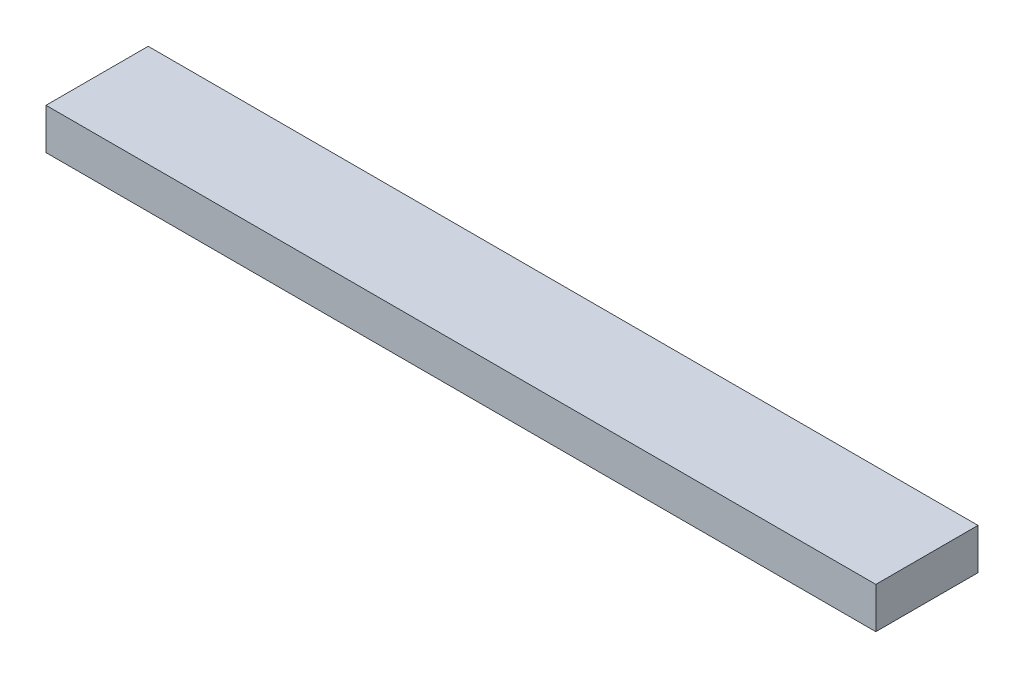
ISO-10303-21;
HEADER;
FILE_DESCRIPTION(('STEP AP214'),'2;1');
FILE_NAME('part.step','',(''),(''),'','','');
FILE_SCHEMA(('AUTOMOTIVE_DESIGN { 1 0 10303 214 1 1 1 1 }'));
ENDSEC;
DATA;
#1=APPLICATION_CONTEXT('core data for automotive mechanical design processes');
#2=APPLICATION_PROTOCOL_DEFINITION('international standard','automotive_design',2000,#1);
#3=PRODUCT_CONTEXT('',#1,'mechanical');
#4=PRODUCT('Part','Part','',(#3));
#5=PRODUCT_RELATED_PRODUCT_CATEGORY('part','',(#4));
#6=PRODUCT_DEFINITION_FORMATION('','',#4);
#7=PRODUCT_DEFINITION_CONTEXT('part definition',#1,'design');
#8=PRODUCT_DEFINITION('design','',#6,#7);
#9=PRODUCT_DEFINITION_SHAPE('','',#8);
#10=(LENGTH_UNIT() NAMED_UNIT(*) SI_UNIT(.MILLI.,.METRE.));
#11=(NAMED_UNIT(*) PLANE_ANGLE_UNIT() SI_UNIT($,.RADIAN.));
#12=(NAMED_UNIT(*) SI_UNIT($,.STERADIAN.) SOLID_ANGLE_UNIT());
#13=UNCERTAINTY_MEASURE_WITH_UNIT(LENGTH_MEASURE(1.E-05),#10,'distance_accuracy_value','');
#14=(GEOMETRIC_REPRESENTATION_CONTEXT(3) GLOBAL_UNCERTAINTY_ASSIGNED_CONTEXT((#13)) GLOBAL_UNIT_ASSIGNED_CONTEXT((#10,
#11,#12)) REPRESENTATION_CONTEXT('',''));
#15=CARTESIAN_POINT('',(0.,0.,0.));
#16=DIRECTION('',(0.,0.,1.));
#17=DIRECTION('',(1.,0.,0.));
#18=AXIS2_PLACEMENT_3D('',#15,#16,#17);
#19=CARTESIAN_POINT('',(31.875,-3.15,-3.925));
#20=DIRECTION('',(1.,0.,0.));
#21=DIRECTION('',(0.,0.,-1.));
#22=AXIS2_PLACEMENT_3D('',#19,#20,#21);
#23=PLANE('',#22);
#24=DIRECTION('',(0.,0.,-1.));
#25=VECTOR('',#24,1.);
#26=CARTESIAN_POINT('',(31.875,0.,-3.925));
#27=LINE('',#26,#25);
#28=CARTESIAN_POINT('',(31.875,0.,3.925));
#29=VERTEX_POINT('',#28);
#30=CARTESIAN_POINT('',(31.875,0.,-3.925));
#31=VERTEX_POINT('',#30);
#32=EDGE_CURVE('E118',#29,#31,#27,.T.);
#33=ORIENTED_EDGE('',*,*,#32,.F.);
#34=DIRECTION('',(0.,1.,0.));
#35=VECTOR('',#34,1.);
#36=CARTESIAN_POINT('',(31.875,-3.15,3.925));
#37=LINE('',#36,#35);
#38=CARTESIAN_POINT('',(31.875,-3.15,3.925));
#39=VERTEX_POINT('',#38);
#40=EDGE_CURVE('E58',#39,#29,#37,.T.);
#41=ORIENTED_EDGE('',*,*,#40,.F.);
#42=DIRECTION('',(0.,0.,-1.));
#43=VECTOR('',#42,1.);
#44=CARTESIAN_POINT('',(31.875,-3.15,-3.925));
#45=LINE('',#44,#43);
#46=CARTESIAN_POINT('',(31.875,-3.15,-3.925));
#47=VERTEX_POINT('',#46);
#48=EDGE_CURVE('E150',#39,#47,#45,.T.);
#49=ORIENTED_EDGE('',*,*,#48,.T.);
#50=DIRECTION('',(0.,1.,0.));
#51=VECTOR('',#50,1.);
#52=CARTESIAN_POINT('',(31.875,-3.15,-3.925));
#53=LINE('',#52,#51);
#54=EDGE_CURVE('E84',#47,#31,#53,.T.);
#55=ORIENTED_EDGE('',*,*,#54,.T.);
#56=EDGE_LOOP('',(#33,#41,#49,#55));
#57=FACE_BOUND('',#56,.T.);
#58=ADVANCED_FACE('F35',(#57),#23,.T.);
#59=CARTESIAN_POINT('',(-31.875,-3.15,3.925));
#60=DIRECTION('',(0.,0.,1.));
#61=DIRECTION('',(1.,0.,0.));
#62=AXIS2_PLACEMENT_3D('',#59,#60,#61);
#63=PLANE('',#62);
#64=DIRECTION('',(1.,0.,0.));
#65=VECTOR('',#64,1.);
#66=CARTESIAN_POINT('',(-31.875,0.,3.925));
#67=LINE('',#66,#65);
#68=CARTESIAN_POINT('',(-31.875,0.,3.925));
#69=VERTEX_POINT('',#68);
#70=EDGE_CURVE('E153',#69,#29,#67,.T.);
#71=ORIENTED_EDGE('',*,*,#70,.F.);
#72=DIRECTION('',(0.,1.,0.));
#73=VECTOR('',#72,1.);
#74=CARTESIAN_POINT('',(-31.875,-3.15,3.925));
#75=LINE('',#74,#73);
#76=CARTESIAN_POINT('',(-31.875,-3.15,3.925));
#77=VERTEX_POINT('',#76);
#78=EDGE_CURVE('E172',#77,#69,#75,.T.);
#79=ORIENTED_EDGE('',*,*,#78,.F.);
#80=DIRECTION('',(1.,0.,0.));
#81=VECTOR('',#80,1.);
#82=CARTESIAN_POINT('',(-31.875,-3.15,3.925));
#83=LINE('',#82,#81);
#84=EDGE_CURVE('E158',#77,#39,#83,.T.);
#85=ORIENTED_EDGE('',*,*,#84,.T.);
#86=ORIENTED_EDGE('',*,*,#40,.T.);
#87=EDGE_LOOP('',(#71,#79,#85,#86));
#88=FACE_BOUND('',#87,.T.);
#89=ADVANCED_FACE('F226',(#88),#63,.T.);
#90=CARTESIAN_POINT('',(-31.875,-3.15,-3.925));
#91=DIRECTION('',(-1.,0.,0.));
#92=DIRECTION('',(0.,0.,1.));
#93=AXIS2_PLACEMENT_3D('',#90,#91,#92);
#94=PLANE('',#93);
#95=DIRECTION('',(0.,0.,1.));
#96=VECTOR('',#95,1.);
#97=CARTESIAN_POINT('',(-31.875,0.,-3.925));
#98=LINE('',#97,#96);
#99=CARTESIAN_POINT('',(-31.875,0.,-3.925));
#100=VERTEX_POINT('',#99);
#101=EDGE_CURVE('E165',#100,#69,#98,.T.);
#102=ORIENTED_EDGE('',*,*,#101,.F.);
#103=DIRECTION('',(0.,1.,0.));
#104=VECTOR('',#103,1.);
#105=CARTESIAN_POINT('',(-31.875,-3.15,-3.925));
#106=LINE('',#105,#104);
#107=CARTESIAN_POINT('',(-31.875,-3.15,-3.925));
#108=VERTEX_POINT('',#107);
#109=EDGE_CURVE('E174',#108,#100,#106,.T.);
#110=ORIENTED_EDGE('',*,*,#109,.F.);
#111=DIRECTION('',(0.,0.,1.));
#112=VECTOR('',#111,1.);
#113=CARTESIAN_POINT('',(-31.875,-3.15,-3.925));
#114=LINE('',#113,#112);
#115=EDGE_CURVE('E155',#108,#77,#114,.T.);
#116=ORIENTED_EDGE('',*,*,#115,.T.);
#117=ORIENTED_EDGE('',*,*,#78,.T.);
#118=EDGE_LOOP('',(#102,#110,#116,#117));
#119=FACE_BOUND('',#118,.T.);
#120=ADVANCED_FACE('F230',(#119),#94,.T.);
#121=CARTESIAN_POINT('',(-31.875,-3.15,-3.925));
#122=DIRECTION('',(0.,0.,-1.));
#123=DIRECTION('',(-1.,0.,0.));
#124=AXIS2_PLACEMENT_3D('',#121,#122,#123);
#125=PLANE('',#124);
#126=DIRECTION('',(-1.,0.,0.));
#127=VECTOR('',#126,1.);
#128=CARTESIAN_POINT('',(-31.875,0.,-3.925));
#129=LINE('',#128,#127);
#130=EDGE_CURVE('E162',#31,#100,#129,.T.);
#131=ORIENTED_EDGE('',*,*,#130,.F.);
#132=ORIENTED_EDGE('',*,*,#54,.F.);
#133=DIRECTION('',(-1.,0.,0.));
#134=VECTOR('',#133,1.);
#135=CARTESIAN_POINT('',(-31.875,-3.15,-3.925));
#136=LINE('',#135,#134);
#137=EDGE_CURVE('E152',#47,#108,#136,.T.);
#138=ORIENTED_EDGE('',*,*,#137,.T.);
#139=ORIENTED_EDGE('',*,*,#109,.T.);
#140=EDGE_LOOP('',(#131,#132,#138,#139));
#141=FACE_BOUND('',#140,.T.);
#142=ADVANCED_FACE('F240',(#141),#125,.T.);
#143=CARTESIAN_POINT('',(0.,-3.15,0.));
#144=DIRECTION('',(0.,1.,0.));
#145=DIRECTION('',(0.,0.,1.));
#146=AXIS2_PLACEMENT_3D('',#143,#144,#145);
#147=PLANE('',#146);
#148=DIRECTION('',(1.,0.,0.));
#149=VECTOR('',#148,1.);
#150=CARTESIAN_POINT('',(0.,-3.15,2.425));
#151=LINE('',#150,#149);
#152=CARTESIAN_POINT('',(-30.375,-3.15,2.425));
#153=VERTEX_POINT('',#152);
#154=CARTESIAN_POINT('',(30.375,-3.15,2.425));
#155=VERTEX_POINT('',#154);
#156=EDGE_CURVE('E145',#153,#155,#151,.T.);
#157=ORIENTED_EDGE('',*,*,#156,.T.);
#158=DIRECTION('',(0.,0.,-1.));
#159=VECTOR('',#158,1.);
#160=CARTESIAN_POINT('',(30.375,-3.15,0.));
#161=LINE('',#160,#159);
#162=CARTESIAN_POINT('',(30.375,-3.15,-2.425));
#163=VERTEX_POINT('',#162);
#164=EDGE_CURVE('E113',#155,#163,#161,.T.);
#165=ORIENTED_EDGE('',*,*,#164,.T.);
#166=DIRECTION('',(-1.,0.,0.));
#167=VECTOR('',#166,1.);
#168=CARTESIAN_POINT('',(0.,-3.15,-2.425));
#169=LINE('',#168,#167);
#170=CARTESIAN_POINT('',(-30.375,-3.15,-2.425));
#171=VERTEX_POINT('',#170);
#172=EDGE_CURVE('E135',#163,#171,#169,.T.);
#173=ORIENTED_EDGE('',*,*,#172,.T.);
#174=DIRECTION('',(0.,0.,1.));
#175=VECTOR('',#174,1.);
#176=CARTESIAN_POINT('',(-30.375,-3.15,0.));
#177=LINE('',#176,#175);
#178=EDGE_CURVE('E49',#171,#153,#177,.T.);
#179=ORIENTED_EDGE('',*,*,#178,.T.);
#180=EDGE_LOOP('',(#157,#165,#173,#179));
#181=FACE_BOUND('',#180,.T.);
#182=ORIENTED_EDGE('',*,*,#48,.F.);
#183=ORIENTED_EDGE('',*,*,#84,.F.);
#184=ORIENTED_EDGE('',*,*,#115,.F.);
#185=ORIENTED_EDGE('',*,*,#137,.F.);
#186=EDGE_LOOP('',(#182,#183,#184,#185));
#187=FACE_BOUND('',#186,.T.);
#188=ADVANCED_FACE('F239',(#181,#187),#147,.F.);
#189=CARTESIAN_POINT('',(0.,0.,0.));
#190=DIRECTION('',(0.,1.,0.));
#191=DIRECTION('',(0.,0.,1.));
#192=AXIS2_PLACEMENT_3D('',#189,#190,#191);
#193=PLANE('',#192);
#194=ORIENTED_EDGE('',*,*,#32,.T.);
#195=ORIENTED_EDGE('',*,*,#130,.T.);
#196=ORIENTED_EDGE('',*,*,#101,.T.);
#197=ORIENTED_EDGE('',*,*,#70,.T.);
#198=EDGE_LOOP('',(#194,#195,#196,#197));
#199=FACE_BOUND('',#198,.T.);
#200=ADVANCED_FACE('F233',(#199),#193,.T.);
#201=CARTESIAN_POINT('',(30.375,-3.15,-3.925));
#202=DIRECTION('',(1.,0.,0.));
#203=DIRECTION('',(0.,0.,-1.));
#204=AXIS2_PLACEMENT_3D('',#201,#202,#203);
#205=PLANE('',#204);
#206=DIRECTION('',(0.,0.,-1.));
#207=VECTOR('',#206,1.);
#208=CARTESIAN_POINT('',(30.375,-1.5,0.));
#209=LINE('',#208,#207);
#210=CARTESIAN_POINT('',(30.375,-1.5,2.425));
#211=VERTEX_POINT('',#210);
#212=CARTESIAN_POINT('',(30.375,-1.5,-2.425));
#213=VERTEX_POINT('',#212);
#214=EDGE_CURVE('E111',#211,#213,#209,.T.);
#215=ORIENTED_EDGE('',*,*,#214,.T.);
#216=DIRECTION('',(0.,1.,0.));
#217=VECTOR('',#216,1.);
#218=CARTESIAN_POINT('',(30.375,-3.15,-2.425));
#219=LINE('',#218,#217);
#220=EDGE_CURVE('E140',#163,#213,#219,.T.);
#221=ORIENTED_EDGE('',*,*,#220,.F.);
#222=ORIENTED_EDGE('',*,*,#164,.F.);
#223=DIRECTION('',(0.,1.,0.));
#224=VECTOR('',#223,1.);
#225=CARTESIAN_POINT('',(30.375,-3.15,2.425));
#226=LINE('',#225,#224);
#227=EDGE_CURVE('E108',#155,#211,#226,.T.);
#228=ORIENTED_EDGE('',*,*,#227,.T.);
#229=EDGE_LOOP('',(#215,#221,#222,#228));
#230=FACE_BOUND('',#229,.T.);
#231=ADVANCED_FACE('F110',(#230),#205,.F.);
#232=CARTESIAN_POINT('',(-31.875,-3.15,2.425));
#233=DIRECTION('',(0.,0.,1.));
#234=DIRECTION('',(1.,0.,0.));
#235=AXIS2_PLACEMENT_3D('',#232,#233,#234);
#236=PLANE('',#235);
#237=DIRECTION('',(1.,0.,0.));
#238=VECTOR('',#237,1.);
#239=CARTESIAN_POINT('',(0.,-1.5,2.425));
#240=LINE('',#239,#238);
#241=CARTESIAN_POINT('',(-30.375,-1.5,2.425));
#242=VERTEX_POINT('',#241);
#243=EDGE_CURVE('E126',#242,#211,#240,.T.);
#244=ORIENTED_EDGE('',*,*,#243,.T.);
#245=ORIENTED_EDGE('',*,*,#227,.F.);
#246=ORIENTED_EDGE('',*,*,#156,.F.);
#247=DIRECTION('',(0.,1.,0.));
#248=VECTOR('',#247,1.);
#249=CARTESIAN_POINT('',(-30.375,-3.15,2.425));
#250=LINE('',#249,#248);
#251=EDGE_CURVE('E119',#153,#242,#250,.T.);
#252=ORIENTED_EDGE('',*,*,#251,.T.);
#253=EDGE_LOOP('',(#244,#245,#246,#252));
#254=FACE_BOUND('',#253,.T.);
#255=ADVANCED_FACE('F131',(#254),#236,.F.);
#256=CARTESIAN_POINT('',(-30.375,-3.15,-3.925));
#257=DIRECTION('',(-1.,0.,0.));
#258=DIRECTION('',(0.,0.,1.));
#259=AXIS2_PLACEMENT_3D('',#256,#257,#258);
#260=PLANE('',#259);
#261=DIRECTION('',(0.,0.,1.));
#262=VECTOR('',#261,1.);
#263=CARTESIAN_POINT('',(-30.375,-1.5,0.));
#264=LINE('',#263,#262);
#265=CARTESIAN_POINT('',(-30.375,-1.5,-2.425));
#266=VERTEX_POINT('',#265);
#267=EDGE_CURVE('E133',#266,#242,#264,.T.);
#268=ORIENTED_EDGE('',*,*,#267,.T.);
#269=ORIENTED_EDGE('',*,*,#251,.F.);
#270=ORIENTED_EDGE('',*,*,#178,.F.);
#271=DIRECTION('',(0.,1.,0.));
#272=VECTOR('',#271,1.);
#273=CARTESIAN_POINT('',(-30.375,-3.15,-2.425));
#274=LINE('',#273,#272);
#275=EDGE_CURVE('E141',#171,#266,#274,.T.);
#276=ORIENTED_EDGE('',*,*,#275,.T.);
#277=EDGE_LOOP('',(#268,#269,#270,#276));
#278=FACE_BOUND('',#277,.T.);
#279=ADVANCED_FACE('F254',(#278),#260,.F.);
#280=CARTESIAN_POINT('',(-31.875,-3.15,-2.425));
#281=DIRECTION('',(0.,0.,-1.));
#282=DIRECTION('',(-1.,0.,0.));
#283=AXIS2_PLACEMENT_3D('',#280,#281,#282);
#284=PLANE('',#283);
#285=DIRECTION('',(-1.,0.,0.));
#286=VECTOR('',#285,1.);
#287=CARTESIAN_POINT('',(0.,-1.5,-2.425));
#288=LINE('',#287,#286);
#289=EDGE_CURVE('E128',#213,#266,#288,.T.);
#290=ORIENTED_EDGE('',*,*,#289,.T.);
#291=ORIENTED_EDGE('',*,*,#275,.F.);
#292=ORIENTED_EDGE('',*,*,#172,.F.);
#293=ORIENTED_EDGE('',*,*,#220,.T.);
#294=EDGE_LOOP('',(#290,#291,#292,#293));
#295=FACE_BOUND('',#294,.T.);
#296=ADVANCED_FACE('F198',(#295),#284,.F.);
#297=CARTESIAN_POINT('',(0.,-1.5,0.));
#298=DIRECTION('',(0.,1.,0.));
#299=DIRECTION('',(0.,0.,1.));
#300=AXIS2_PLACEMENT_3D('',#297,#298,#299);
#301=PLANE('',#300);
#302=CARTESIAN_POINT('',(23.91375,-1.5,0.));
#303=DIRECTION('',(0.,1.,0.));
#304=DIRECTION('',(0.,0.,1.));
#305=AXIS2_PLACEMENT_3D('',#302,#303,#304);
#306=CIRCLE('',#305,1.5);
#307=CARTESIAN_POINT('',(23.91375,-1.5,1.5));
#308=VERTEX_POINT('',#307);
#309=EDGE_CURVE('E12',#308,#308,#306,.F.);
#310=ORIENTED_EDGE('',*,*,#309,.F.);
#311=EDGE_LOOP('',(#310));
#312=FACE_BOUND('',#311,.T.);
#313=CARTESIAN_POINT('',(15.94375,-1.5,0.));
#314=DIRECTION('',(0.,1.,0.));
#315=DIRECTION('',(0.,0.,1.));
#316=AXIS2_PLACEMENT_3D('',#313,#314,#315);
#317=CIRCLE('',#316,1.5);
#318=CARTESIAN_POINT('',(15.94375,-1.5,1.5));
#319=VERTEX_POINT('',#318);
#320=EDGE_CURVE('E42',#319,#319,#317,.F.);
#321=ORIENTED_EDGE('',*,*,#320,.F.);
#322=EDGE_LOOP('',(#321));
#323=FACE_BOUND('',#322,.T.);
#324=CARTESIAN_POINT('',(7.97375000000001,-1.5,0.));
#325=DIRECTION('',(0.,1.,0.));
#326=DIRECTION('',(0.,0.,1.));
#327=AXIS2_PLACEMENT_3D('',#324,#325,#326);
#328=CIRCLE('',#327,1.5);
#329=CARTESIAN_POINT('',(7.97375000000001,-1.5,1.5));
#330=VERTEX_POINT('',#329);
#331=EDGE_CURVE('E188',#330,#330,#328,.F.);
#332=ORIENTED_EDGE('',*,*,#331,.F.);
#333=EDGE_LOOP('',(#332));
#334=FACE_BOUND('',#333,.T.);
#335=CARTESIAN_POINT('',(0.00375000000000722,-1.5,0.));
#336=DIRECTION('',(0.,1.,0.));
#337=DIRECTION('',(0.,0.,1.));
#338=AXIS2_PLACEMENT_3D('',#335,#336,#337);
#339=CIRCLE('',#338,1.5);
#340=CARTESIAN_POINT('',(0.00375000000000722,-1.5,1.5));
#341=VERTEX_POINT('',#340);
#342=EDGE_CURVE('E185',#341,#341,#339,.F.);
#343=ORIENTED_EDGE('',*,*,#342,.F.);
#344=EDGE_LOOP('',(#343));
#345=FACE_BOUND('',#344,.T.);
#346=CARTESIAN_POINT('',(-7.96624999999999,-1.5,0.));
#347=DIRECTION('',(0.,1.,0.));
#348=DIRECTION('',(0.,0.,1.));
#349=AXIS2_PLACEMENT_3D('',#346,#347,#348);
#350=CIRCLE('',#349,1.5);
#351=CARTESIAN_POINT('',(-7.96624999999999,-1.5,1.5));
#352=VERTEX_POINT('',#351);
#353=EDGE_CURVE('E182',#352,#352,#350,.F.);
#354=ORIENTED_EDGE('',*,*,#353,.F.);
#355=EDGE_LOOP('',(#354));
#356=FACE_BOUND('',#355,.T.);
#357=CARTESIAN_POINT('',(-15.93625,-1.5,0.));
#358=DIRECTION('',(0.,1.,0.));
#359=DIRECTION('',(0.,0.,1.));
#360=AXIS2_PLACEMENT_3D('',#357,#358,#359);
#361=CIRCLE('',#360,1.5);
#362=CARTESIAN_POINT('',(-15.93625,-1.5,1.5));
#363=VERTEX_POINT('',#362);
#364=EDGE_CURVE('E179',#363,#363,#361,.F.);
#365=ORIENTED_EDGE('',*,*,#364,.F.);
#366=EDGE_LOOP('',(#365));
#367=FACE_BOUND('',#366,.T.);
#368=CARTESIAN_POINT('',(-23.90625,-1.5,0.));
#369=DIRECTION('',(0.,1.,0.));
#370=DIRECTION('',(0.,0.,1.));
#371=AXIS2_PLACEMENT_3D('',#368,#369,#370);
#372=CIRCLE('',#371,1.5);
#373=CARTESIAN_POINT('',(-23.90625,-1.5,1.5));
#374=VERTEX_POINT('',#373);
#375=EDGE_CURVE('E171',#374,#374,#372,.F.);
#376=ORIENTED_EDGE('',*,*,#375,.F.);
#377=EDGE_LOOP('',(#376));
#378=FACE_BOUND('',#377,.T.);
#379=ORIENTED_EDGE('',*,*,#214,.F.);
#380=ORIENTED_EDGE('',*,*,#243,.F.);
#381=ORIENTED_EDGE('',*,*,#267,.F.);
#382=ORIENTED_EDGE('',*,*,#289,.F.);
#383=EDGE_LOOP('',(#379,#380,#381,#382));
#384=FACE_BOUND('',#383,.T.);
#385=ADVANCED_FACE('F124',(#312,#323,#334,#345,#356,#367,#378,#384),#301,.F.);
#386=CARTESIAN_POINT('',(-23.90625,-7.39264068711929,0.));
#387=DIRECTION('',(0.,1.,0.));
#388=DIRECTION('',(0.,0.,1.));
#389=AXIS2_PLACEMENT_3D('',#386,#387,#388);
#390=CYLINDRICAL_SURFACE('',#389,1.5);
#391=CARTESIAN_POINT('',(-23.90625,-2.95,0.));
#392=DIRECTION('',(0.,1.,0.));
#393=DIRECTION('',(0.,0.,1.));
#394=AXIS2_PLACEMENT_3D('',#391,#392,#393);
#395=CIRCLE('',#394,1.5);
#396=CARTESIAN_POINT('',(-23.90625,-2.95,1.5));
#397=VERTEX_POINT('',#396);
#398=EDGE_CURVE('E274',#397,#397,#395,.T.);
#399=ORIENTED_EDGE('',*,*,#398,.T.);
#400=EDGE_LOOP('',(#399));
#401=FACE_BOUND('',#400,.T.);
#402=ORIENTED_EDGE('',*,*,#375,.T.);
#403=EDGE_LOOP('',(#402));
#404=FACE_BOUND('',#403,.T.);
#405=ADVANCED_FACE('F197',(#401,#404),#390,.T.);
#406=CARTESIAN_POINT('',(-23.90625,-7.39264068711929,0.));
#407=DIRECTION('',(0.,1.,0.));
#408=DIRECTION('',(0.,0.,1.));
#409=AXIS2_PLACEMENT_3D('',#406,#407,#408);
#410=CYLINDRICAL_SURFACE('',#409,0.699999999999998);
#411=CARTESIAN_POINT('',(-23.90625,-2.95,0.));
#412=DIRECTION('',(0.,1.,0.));
#413=DIRECTION('',(0.,0.,1.));
#414=AXIS2_PLACEMENT_3D('',#411,#412,#413);
#415=CIRCLE('',#414,0.699999999999998);
#416=CARTESIAN_POINT('',(-23.90625,-2.95,0.699999999999998));
#417=VERTEX_POINT('',#416);
#418=EDGE_CURVE('E129',#417,#417,#415,.T.);
#419=ORIENTED_EDGE('',*,*,#418,.F.);
#420=EDGE_LOOP('',(#419));
#421=FACE_BOUND('',#420,.T.);
#422=CARTESIAN_POINT('',(-23.90625,-1.5,0.));
#423=DIRECTION('',(0.,-1.,0.));
#424=DIRECTION('',(0.,0.,-1.));
#425=AXIS2_PLACEMENT_3D('',#422,#423,#424);
#426=CIRCLE('',#425,0.699999999999998);
#427=CARTESIAN_POINT('',(-23.90625,-1.5,-0.699999999999998));
#428=VERTEX_POINT('',#427);
#429=EDGE_CURVE('E275',#428,#428,#426,.T.);
#430=ORIENTED_EDGE('',*,*,#429,.F.);
#431=EDGE_LOOP('',(#430));
#432=FACE_BOUND('',#431,.T.);
#433=ADVANCED_FACE('F214',(#421,#432),#410,.F.);
#434=CARTESIAN_POINT('',(0.,-2.95,0.));
#435=DIRECTION('',(0.,1.,0.));
#436=DIRECTION('',(0.,0.,1.));
#437=AXIS2_PLACEMENT_3D('',#434,#435,#436);
#438=PLANE('',#437);
#439=ORIENTED_EDGE('',*,*,#418,.T.);
#440=EDGE_LOOP('',(#439));
#441=FACE_BOUND('',#440,.T.);
#442=ORIENTED_EDGE('',*,*,#398,.F.);
#443=EDGE_LOOP('',(#442));
#444=FACE_BOUND('',#443,.T.);
#445=ADVANCED_FACE('F220',(#441,#444),#438,.F.);
#446=ORIENTED_EDGE('',*,*,#429,.T.);
#447=EDGE_LOOP('',(#446));
#448=FACE_BOUND('',#447,.T.);
#449=ADVANCED_FACE('F202',(#448),#301,.F.);
#450=CARTESIAN_POINT('',(-15.93625,-7.39264068711929,0.));
#451=DIRECTION('',(0.,1.,0.));
#452=DIRECTION('',(0.,0.,1.));
#453=AXIS2_PLACEMENT_3D('',#450,#451,#452);
#454=CYLINDRICAL_SURFACE('',#453,1.5);
#455=CARTESIAN_POINT('',(-15.93625,-2.95,0.));
#456=DIRECTION('',(0.,1.,0.));
#457=DIRECTION('',(0.,0.,1.));
#458=AXIS2_PLACEMENT_3D('',#455,#456,#457);
#459=CIRCLE('',#458,1.5);
#460=CARTESIAN_POINT('',(-15.93625,-2.95,1.5));
#461=VERTEX_POINT('',#460);
#462=EDGE_CURVE('E284',#461,#461,#459,.T.);
#463=ORIENTED_EDGE('',*,*,#462,.T.);
#464=EDGE_LOOP('',(#463));
#465=FACE_BOUND('',#464,.T.);
#466=ORIENTED_EDGE('',*,*,#364,.T.);
#467=EDGE_LOOP('',(#466));
#468=FACE_BOUND('',#467,.T.);
#469=ADVANCED_FACE('F267',(#465,#468),#454,.T.);
#470=CARTESIAN_POINT('',(-15.93625,-7.39264068711929,0.));
#471=DIRECTION('',(0.,1.,0.));
#472=DIRECTION('',(0.,0.,1.));
#473=AXIS2_PLACEMENT_3D('',#470,#471,#472);
#474=CYLINDRICAL_SURFACE('',#473,0.699999999999996);
#475=CARTESIAN_POINT('',(-15.93625,-2.95,0.));
#476=DIRECTION('',(0.,1.,0.));
#477=DIRECTION('',(0.,0.,1.));
#478=AXIS2_PLACEMENT_3D('',#475,#476,#477);
#479=CIRCLE('',#478,0.699999999999996);
#480=CARTESIAN_POINT('',(-15.93625,-2.95,0.699999999999996));
#481=VERTEX_POINT('',#480);
#482=EDGE_CURVE('E279',#481,#481,#479,.T.);
#483=ORIENTED_EDGE('',*,*,#482,.F.);
#484=EDGE_LOOP('',(#483));
#485=FACE_BOUND('',#484,.T.);
#486=CARTESIAN_POINT('',(-15.93625,-1.5,0.));
#487=DIRECTION('',(0.,-1.,0.));
#488=DIRECTION('',(0.,0.,-1.));
#489=AXIS2_PLACEMENT_3D('',#486,#487,#488);
#490=CIRCLE('',#489,0.699999999999996);
#491=CARTESIAN_POINT('',(-15.93625,-1.5,-0.699999999999996));
#492=VERTEX_POINT('',#491);
#493=EDGE_CURVE('E287',#492,#492,#490,.T.);
#494=ORIENTED_EDGE('',*,*,#493,.F.);
#495=EDGE_LOOP('',(#494));
#496=FACE_BOUND('',#495,.T.);
#497=ADVANCED_FACE('F406',(#485,#496),#474,.F.);
#498=CARTESIAN_POINT('',(0.,-2.95,0.));
#499=DIRECTION('',(0.,1.,0.));
#500=DIRECTION('',(0.,0.,1.));
#501=AXIS2_PLACEMENT_3D('',#498,#499,#500);
#502=PLANE('',#501);
#503=ORIENTED_EDGE('',*,*,#482,.T.);
#504=EDGE_LOOP('',(#503));
#505=FACE_BOUND('',#504,.T.);
#506=ORIENTED_EDGE('',*,*,#462,.F.);
#507=EDGE_LOOP('',(#506));
#508=FACE_BOUND('',#507,.T.);
#509=ADVANCED_FACE('F409',(#505,#508),#502,.F.);
#510=ORIENTED_EDGE('',*,*,#493,.T.);
#511=EDGE_LOOP('',(#510));
#512=FACE_BOUND('',#511,.T.);
#513=ADVANCED_FACE('F269',(#512),#301,.F.);
#514=CARTESIAN_POINT('',(-7.96624999999999,-7.39264068711929,0.));
#515=DIRECTION('',(0.,1.,0.));
#516=DIRECTION('',(0.,0.,1.));
#517=AXIS2_PLACEMENT_3D('',#514,#515,#516);
#518=CYLINDRICAL_SURFACE('',#517,1.5);
#519=CARTESIAN_POINT('',(-7.96624999999999,-2.95,0.));
#520=DIRECTION('',(0.,1.,0.));
#521=DIRECTION('',(0.,0.,1.));
#522=AXIS2_PLACEMENT_3D('',#519,#520,#521);
#523=CIRCLE('',#522,1.5);
#524=CARTESIAN_POINT('',(-7.96624999999999,-2.95,1.5));
#525=VERTEX_POINT('',#524);
#526=EDGE_CURVE('E293',#525,#525,#523,.T.);
#527=ORIENTED_EDGE('',*,*,#526,.T.);
#528=EDGE_LOOP('',(#527));
#529=FACE_BOUND('',#528,.T.);
#530=ORIENTED_EDGE('',*,*,#353,.T.);
#531=EDGE_LOOP('',(#530));
#532=FACE_BOUND('',#531,.T.);
#533=ADVANCED_FACE('F392',(#529,#532),#518,.T.);
#534=CARTESIAN_POINT('',(-7.96624999999999,-7.39264068711929,0.));
#535=DIRECTION('',(0.,1.,0.));
#536=DIRECTION('',(0.,0.,1.));
#537=AXIS2_PLACEMENT_3D('',#534,#535,#536);
#538=CYLINDRICAL_SURFACE('',#537,0.699999999999998);
#539=CARTESIAN_POINT('',(-7.96624999999999,-2.95,0.));
#540=DIRECTION('',(0.,1.,0.));
#541=DIRECTION('',(0.,0.,1.));
#542=AXIS2_PLACEMENT_3D('',#539,#540,#541);
#543=CIRCLE('',#542,0.699999999999998);
#544=CARTESIAN_POINT('',(-7.96624999999999,-2.95,0.699999999999998));
#545=VERTEX_POINT('',#544);
#546=EDGE_CURVE('E290',#545,#545,#543,.T.);
#547=ORIENTED_EDGE('',*,*,#546,.F.);
#548=EDGE_LOOP('',(#547));
#549=FACE_BOUND('',#548,.T.);
#550=CARTESIAN_POINT('',(-7.96624999999999,-1.5,0.));
#551=DIRECTION('',(0.,-1.,0.));
#552=DIRECTION('',(0.,0.,-1.));
#553=AXIS2_PLACEMENT_3D('',#550,#551,#552);
#554=CIRCLE('',#553,0.699999999999998);
#555=CARTESIAN_POINT('',(-7.96624999999999,-1.5,-0.699999999999998));
#556=VERTEX_POINT('',#555);
#557=EDGE_CURVE('E296',#556,#556,#554,.T.);
#558=ORIENTED_EDGE('',*,*,#557,.F.);
#559=EDGE_LOOP('',(#558));
#560=FACE_BOUND('',#559,.T.);
#561=ADVANCED_FACE('F395',(#549,#560),#538,.F.);
#562=CARTESIAN_POINT('',(0.,-2.95,0.));
#563=DIRECTION('',(0.,1.,0.));
#564=DIRECTION('',(0.,0.,1.));
#565=AXIS2_PLACEMENT_3D('',#562,#563,#564);
#566=PLANE('',#565);
#567=ORIENTED_EDGE('',*,*,#546,.T.);
#568=EDGE_LOOP('',(#567));
#569=FACE_BOUND('',#568,.T.);
#570=ORIENTED_EDGE('',*,*,#526,.F.);
#571=EDGE_LOOP('',(#570));
#572=FACE_BOUND('',#571,.T.);
#573=ADVANCED_FACE('F399',(#569,#572),#566,.F.);
#574=ORIENTED_EDGE('',*,*,#557,.T.);
#575=EDGE_LOOP('',(#574));
#576=FACE_BOUND('',#575,.T.);
#577=ADVANCED_FACE('F383',(#576),#301,.F.);
#578=CARTESIAN_POINT('',(0.00375000000000722,-7.39264068711929,0.));
#579=DIRECTION('',(0.,1.,0.));
#580=DIRECTION('',(0.,0.,1.));
#581=AXIS2_PLACEMENT_3D('',#578,#579,#580);
#582=CYLINDRICAL_SURFACE('',#581,1.5);
#583=CARTESIAN_POINT('',(0.00375000000000722,-2.95,0.));
#584=DIRECTION('',(0.,1.,0.));
#585=DIRECTION('',(0.,0.,1.));
#586=AXIS2_PLACEMENT_3D('',#583,#584,#585);
#587=CIRCLE('',#586,1.5);
#588=CARTESIAN_POINT('',(0.00375000000000722,-2.95,1.5));
#589=VERTEX_POINT('',#588);
#590=EDGE_CURVE('E302',#589,#589,#587,.T.);
#591=ORIENTED_EDGE('',*,*,#590,.T.);
#592=EDGE_LOOP('',(#591));
#593=FACE_BOUND('',#592,.T.);
#594=ORIENTED_EDGE('',*,*,#342,.T.);
#595=EDGE_LOOP('',(#594));
#596=FACE_BOUND('',#595,.T.);
#597=ADVANCED_FACE('F379',(#593,#596),#582,.T.);
#598=CARTESIAN_POINT('',(0.00375000000000722,-7.39264068711929,0.));
#599=DIRECTION('',(0.,1.,0.));
#600=DIRECTION('',(0.,0.,1.));
#601=AXIS2_PLACEMENT_3D('',#598,#599,#600);
#602=CYLINDRICAL_SURFACE('',#601,0.699999999999998);
#603=CARTESIAN_POINT('',(0.00375000000000722,-2.95,0.));
#604=DIRECTION('',(0.,1.,0.));
#605=DIRECTION('',(0.,0.,1.));
#606=AXIS2_PLACEMENT_3D('',#603,#604,#605);
#607=CIRCLE('',#606,0.699999999999998);
#608=CARTESIAN_POINT('',(0.00375000000000722,-2.95,0.699999999999998));
#609=VERTEX_POINT('',#608);
#610=EDGE_CURVE('E299',#609,#609,#607,.T.);
#611=ORIENTED_EDGE('',*,*,#610,.F.);
#612=EDGE_LOOP('',(#611));
#613=FACE_BOUND('',#612,.T.);
#614=CARTESIAN_POINT('',(0.00375000000000722,-1.5,0.));
#615=DIRECTION('',(0.,-1.,0.));
#616=DIRECTION('',(0.,0.,-1.));
#617=AXIS2_PLACEMENT_3D('',#614,#615,#616);
#618=CIRCLE('',#617,0.699999999999998);
#619=CARTESIAN_POINT('',(0.00375000000000722,-1.5,-0.699999999999998));
#620=VERTEX_POINT('',#619);
#621=EDGE_CURVE('E305',#620,#620,#618,.T.);
#622=ORIENTED_EDGE('',*,*,#621,.F.);
#623=EDGE_LOOP('',(#622));
#624=FACE_BOUND('',#623,.T.);
#625=ADVANCED_FACE('F382',(#613,#624),#602,.F.);
#626=CARTESIAN_POINT('',(0.,-2.95,0.));
#627=DIRECTION('',(0.,1.,0.));
#628=DIRECTION('',(0.,0.,1.));
#629=AXIS2_PLACEMENT_3D('',#626,#627,#628);
#630=PLANE('',#629);
#631=ORIENTED_EDGE('',*,*,#610,.T.);
#632=EDGE_LOOP('',(#631));
#633=FACE_BOUND('',#632,.T.);
#634=ORIENTED_EDGE('',*,*,#590,.F.);
#635=EDGE_LOOP('',(#634));
#636=FACE_BOUND('',#635,.T.);
#637=ADVANCED_FACE('F387',(#633,#636),#630,.F.);
#638=ORIENTED_EDGE('',*,*,#621,.T.);
#639=EDGE_LOOP('',(#638));
#640=FACE_BOUND('',#639,.T.);
#641=ADVANCED_FACE('F370',(#640),#301,.F.);
#642=CARTESIAN_POINT('',(7.97375000000001,-7.39264068711929,0.));
#643=DIRECTION('',(0.,1.,0.));
#644=DIRECTION('',(0.,0.,1.));
#645=AXIS2_PLACEMENT_3D('',#642,#643,#644);
#646=CYLINDRICAL_SURFACE('',#645,1.5);
#647=CARTESIAN_POINT('',(7.97375000000001,-2.95,0.));
#648=DIRECTION('',(0.,1.,0.));
#649=DIRECTION('',(0.,0.,1.));
#650=AXIS2_PLACEMENT_3D('',#647,#648,#649);
#651=CIRCLE('',#650,1.5);
#652=CARTESIAN_POINT('',(7.97375000000001,-2.95,1.5));
#653=VERTEX_POINT('',#652);
#654=EDGE_CURVE('E311',#653,#653,#651,.T.);
#655=ORIENTED_EDGE('',*,*,#654,.T.);
#656=EDGE_LOOP('',(#655));
#657=FACE_BOUND('',#656,.T.);
#658=ORIENTED_EDGE('',*,*,#331,.T.);
#659=EDGE_LOOP('',(#658));
#660=FACE_BOUND('',#659,.T.);
#661=ADVANCED_FACE('F366',(#657,#660),#646,.T.);
#662=CARTESIAN_POINT('',(7.97375000000001,-7.39264068711929,0.));
#663=DIRECTION('',(0.,1.,0.));
#664=DIRECTION('',(0.,0.,1.));
#665=AXIS2_PLACEMENT_3D('',#662,#663,#664);
#666=CYLINDRICAL_SURFACE('',#665,0.699999999999998);
#667=CARTESIAN_POINT('',(7.97375000000001,-2.95,0.));
#668=DIRECTION('',(0.,1.,0.));
#669=DIRECTION('',(0.,0.,1.));
#670=AXIS2_PLACEMENT_3D('',#667,#668,#669);
#671=CIRCLE('',#670,0.699999999999998);
#672=CARTESIAN_POINT('',(7.97375000000001,-2.95,0.699999999999998));
#673=VERTEX_POINT('',#672);
#674=EDGE_CURVE('E308',#673,#673,#671,.T.);
#675=ORIENTED_EDGE('',*,*,#674,.F.);
#676=EDGE_LOOP('',(#675));
#677=FACE_BOUND('',#676,.T.);
#678=CARTESIAN_POINT('',(7.97375000000001,-1.5,0.));
#679=DIRECTION('',(0.,-1.,0.));
#680=DIRECTION('',(0.,0.,-1.));
#681=AXIS2_PLACEMENT_3D('',#678,#679,#680);
#682=CIRCLE('',#681,0.699999999999998);
#683=CARTESIAN_POINT('',(7.97375000000001,-1.5,-0.699999999999998));
#684=VERTEX_POINT('',#683);
#685=EDGE_CURVE('E314',#684,#684,#682,.T.);
#686=ORIENTED_EDGE('',*,*,#685,.F.);
#687=EDGE_LOOP('',(#686));
#688=FACE_BOUND('',#687,.T.);
#689=ADVANCED_FACE('F369',(#677,#688),#666,.F.);
#690=CARTESIAN_POINT('',(0.,-2.95,0.));
#691=DIRECTION('',(0.,1.,0.));
#692=DIRECTION('',(0.,0.,1.));
#693=AXIS2_PLACEMENT_3D('',#690,#691,#692);
#694=PLANE('',#693);
#695=ORIENTED_EDGE('',*,*,#674,.T.);
#696=EDGE_LOOP('',(#695));
#697=FACE_BOUND('',#696,.T.);
#698=ORIENTED_EDGE('',*,*,#654,.F.);
#699=EDGE_LOOP('',(#698));
#700=FACE_BOUND('',#699,.T.);
#701=ADVANCED_FACE('F374',(#697,#700),#694,.F.);
#702=ORIENTED_EDGE('',*,*,#685,.T.);
#703=EDGE_LOOP('',(#702));
#704=FACE_BOUND('',#703,.T.);
#705=ADVANCED_FACE('F357',(#704),#301,.F.);
#706=CARTESIAN_POINT('',(15.94375,-7.39264068711929,0.));
#707=DIRECTION('',(0.,1.,0.));
#708=DIRECTION('',(0.,0.,1.));
#709=AXIS2_PLACEMENT_3D('',#706,#707,#708);
#710=CYLINDRICAL_SURFACE('',#709,1.5);
#711=CARTESIAN_POINT('',(15.94375,-2.95,0.));
#712=DIRECTION('',(0.,1.,0.));
#713=DIRECTION('',(0.,0.,1.));
#714=AXIS2_PLACEMENT_3D('',#711,#712,#713);
#715=CIRCLE('',#714,1.5);
#716=CARTESIAN_POINT('',(15.94375,-2.95,1.5));
#717=VERTEX_POINT('',#716);
#718=EDGE_CURVE('E320',#717,#717,#715,.T.);
#719=ORIENTED_EDGE('',*,*,#718,.T.);
#720=EDGE_LOOP('',(#719));
#721=FACE_BOUND('',#720,.T.);
#722=ORIENTED_EDGE('',*,*,#320,.T.);
#723=EDGE_LOOP('',(#722));
#724=FACE_BOUND('',#723,.T.);
#725=ADVANCED_FACE('F193',(#721,#724),#710,.T.);
#726=CARTESIAN_POINT('',(15.94375,-7.39264068711929,0.));
#727=DIRECTION('',(0.,1.,0.));
#728=DIRECTION('',(0.,0.,1.));
#729=AXIS2_PLACEMENT_3D('',#726,#727,#728);
#730=CYLINDRICAL_SURFACE('',#729,0.699999999999998);
#731=CARTESIAN_POINT('',(15.94375,-2.95,0.));
#732=DIRECTION('',(0.,1.,0.));
#733=DIRECTION('',(0.,0.,1.));
#734=AXIS2_PLACEMENT_3D('',#731,#732,#733);
#735=CIRCLE('',#734,0.699999999999998);
#736=CARTESIAN_POINT('',(15.94375,-2.95,0.699999999999998));
#737=VERTEX_POINT('',#736);
#738=EDGE_CURVE('E317',#737,#737,#735,.T.);
#739=ORIENTED_EDGE('',*,*,#738,.F.);
#740=EDGE_LOOP('',(#739));
#741=FACE_BOUND('',#740,.T.);
#742=CARTESIAN_POINT('',(15.94375,-1.5,0.));
#743=DIRECTION('',(0.,-1.,0.));
#744=DIRECTION('',(0.,0.,-1.));
#745=AXIS2_PLACEMENT_3D('',#742,#743,#744);
#746=CIRCLE('',#745,0.699999999999998);
#747=CARTESIAN_POINT('',(15.94375,-1.5,-0.699999999999998));
#748=VERTEX_POINT('',#747);
#749=EDGE_CURVE('E323',#748,#748,#746,.T.);
#750=ORIENTED_EDGE('',*,*,#749,.F.);
#751=EDGE_LOOP('',(#750));
#752=FACE_BOUND('',#751,.T.);
#753=ADVANCED_FACE('F356',(#741,#752),#730,.F.);
#754=CARTESIAN_POINT('',(0.,-2.95,0.));
#755=DIRECTION('',(0.,1.,0.));
#756=DIRECTION('',(0.,0.,1.));
#757=AXIS2_PLACEMENT_3D('',#754,#755,#756);
#758=PLANE('',#757);
#759=ORIENTED_EDGE('',*,*,#738,.T.);
#760=EDGE_LOOP('',(#759));
#761=FACE_BOUND('',#760,.T.);
#762=ORIENTED_EDGE('',*,*,#718,.F.);
#763=EDGE_LOOP('',(#762));
#764=FACE_BOUND('',#763,.T.);
#765=ADVANCED_FACE('F361',(#761,#764),#758,.F.);
#766=ORIENTED_EDGE('',*,*,#749,.T.);
#767=EDGE_LOOP('',(#766));
#768=FACE_BOUND('',#767,.T.);
#769=ADVANCED_FACE('F349',(#768),#301,.F.);
#770=CARTESIAN_POINT('',(23.91375,-7.39264068711929,0.));
#771=DIRECTION('',(0.,1.,0.));
#772=DIRECTION('',(0.,0.,1.));
#773=AXIS2_PLACEMENT_3D('',#770,#771,#772);
#774=CYLINDRICAL_SURFACE('',#773,1.5);
#775=CARTESIAN_POINT('',(23.91375,-2.95,0.));
#776=DIRECTION('',(0.,1.,0.));
#777=DIRECTION('',(0.,0.,1.));
#778=AXIS2_PLACEMENT_3D('',#775,#776,#777);
#779=CIRCLE('',#778,1.5);
#780=CARTESIAN_POINT('',(23.91375,-2.95,1.5));
#781=VERTEX_POINT('',#780);
#782=EDGE_CURVE('E329',#781,#781,#779,.T.);
#783=ORIENTED_EDGE('',*,*,#782,.T.);
#784=EDGE_LOOP('',(#783));
#785=FACE_BOUND('',#784,.T.);
#786=ORIENTED_EDGE('',*,*,#309,.T.);
#787=EDGE_LOOP('',(#786));
#788=FACE_BOUND('',#787,.T.);
#789=ADVANCED_FACE('F340',(#785,#788),#774,.T.);
#790=CARTESIAN_POINT('',(23.91375,-7.39264068711929,0.));
#791=DIRECTION('',(0.,1.,0.));
#792=DIRECTION('',(0.,0.,1.));
#793=AXIS2_PLACEMENT_3D('',#790,#791,#792);
#794=CYLINDRICAL_SURFACE('',#793,0.699999999999998);
#795=CARTESIAN_POINT('',(23.91375,-2.95,0.));
#796=DIRECTION('',(0.,1.,0.));
#797=DIRECTION('',(0.,0.,1.));
#798=AXIS2_PLACEMENT_3D('',#795,#796,#797);
#799=CIRCLE('',#798,0.699999999999998);
#800=CARTESIAN_POINT('',(23.91375,-2.95,0.699999999999998));
#801=VERTEX_POINT('',#800);
#802=EDGE_CURVE('E326',#801,#801,#799,.T.);
#803=ORIENTED_EDGE('',*,*,#802,.F.);
#804=EDGE_LOOP('',(#803));
#805=FACE_BOUND('',#804,.T.);
#806=CARTESIAN_POINT('',(23.91375,-1.5,0.));
#807=DIRECTION('',(0.,-1.,0.));
#808=DIRECTION('',(0.,0.,-1.));
#809=AXIS2_PLACEMENT_3D('',#806,#807,#808);
#810=CIRCLE('',#809,0.699999999999998);
#811=CARTESIAN_POINT('',(23.91375,-1.5,-0.699999999999998));
#812=VERTEX_POINT('',#811);
#813=EDGE_CURVE('E332',#812,#812,#810,.T.);
#814=ORIENTED_EDGE('',*,*,#813,.F.);
#815=EDGE_LOOP('',(#814));
#816=FACE_BOUND('',#815,.T.);
#817=ADVANCED_FACE('F337',(#805,#816),#794,.F.);
#818=CARTESIAN_POINT('',(0.,-2.95,0.));
#819=DIRECTION('',(0.,1.,0.));
#820=DIRECTION('',(0.,0.,1.));
#821=AXIS2_PLACEMENT_3D('',#818,#819,#820);
#822=PLANE('',#821);
#823=ORIENTED_EDGE('',*,*,#802,.T.);
#824=EDGE_LOOP('',(#823));
#825=FACE_BOUND('',#824,.T.);
#826=ORIENTED_EDGE('',*,*,#782,.F.);
#827=EDGE_LOOP('',(#826));
#828=FACE_BOUND('',#827,.T.);
#829=ADVANCED_FACE('F339',(#825,#828),#822,.F.);
#830=ORIENTED_EDGE('',*,*,#813,.T.);
#831=EDGE_LOOP('',(#830));
#832=FACE_BOUND('',#831,.T.);
#833=ADVANCED_FACE('F201',(#832),#301,.F.);
#834=CLOSED_SHELL('',(#58,#89,#120,#142,#188,#200,#231,#255,#279,#296,#385,#405,#433,#445,#449,
#469,#497,#509,#513,#533,#561,#573,#577,#597,#625,#637,#641,#661,#689,#701,#705,#725,#753,#765,
#769,#789,#817,#829,#833));
#835=MANIFOLD_SOLID_BREP('B2',#834);
#836=ADVANCED_BREP_SHAPE_REPRESENTATION('',(#18,#835),#14);
#837=SHAPE_DEFINITION_REPRESENTATION(#9,#836);
ENDSEC;
END-ISO-10303-21;
